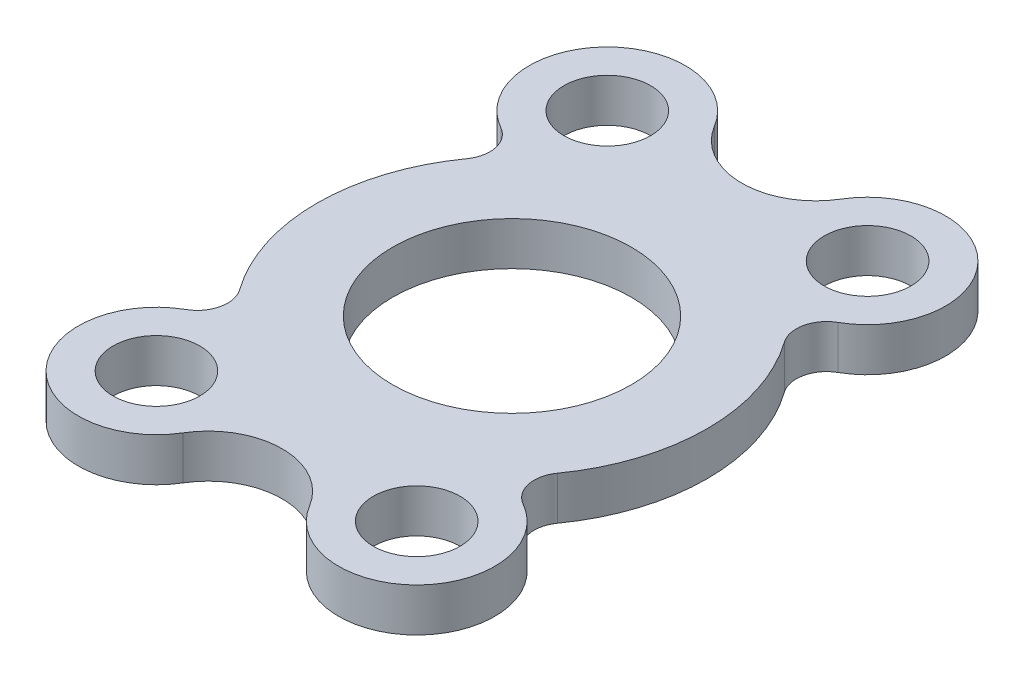
ISO-10303-21;
HEADER;
FILE_DESCRIPTION(('STEP AP214'),'2;1');
FILE_NAME('part.step','',(''),(''),'','','');
FILE_SCHEMA(('AUTOMOTIVE_DESIGN { 1 0 10303 214 1 1 1 1 }'));
ENDSEC;
DATA;
#1=APPLICATION_CONTEXT('core data for automotive mechanical design processes');
#2=APPLICATION_PROTOCOL_DEFINITION('international standard','automotive_design',2000,#1);
#3=PRODUCT_CONTEXT('',#1,'mechanical');
#4=PRODUCT('Part','Part','',(#3));
#5=PRODUCT_RELATED_PRODUCT_CATEGORY('part','',(#4));
#6=PRODUCT_DEFINITION_FORMATION('','',#4);
#7=PRODUCT_DEFINITION_CONTEXT('part definition',#1,'design');
#8=PRODUCT_DEFINITION('design','',#6,#7);
#9=PRODUCT_DEFINITION_SHAPE('','',#8);
#10=(LENGTH_UNIT() NAMED_UNIT(*) SI_UNIT(.MILLI.,.METRE.));
#11=(NAMED_UNIT(*) PLANE_ANGLE_UNIT() SI_UNIT($,.RADIAN.));
#12=(NAMED_UNIT(*) SI_UNIT($,.STERADIAN.) SOLID_ANGLE_UNIT());
#13=UNCERTAINTY_MEASURE_WITH_UNIT(LENGTH_MEASURE(1.E-05),#10,'distance_accuracy_value','');
#14=(GEOMETRIC_REPRESENTATION_CONTEXT(3) GLOBAL_UNCERTAINTY_ASSIGNED_CONTEXT((#13)) GLOBAL_UNIT_ASSIGNED_CONTEXT((#10,
#11,#12)) REPRESENTATION_CONTEXT('',''));
#15=CARTESIAN_POINT('',(0.,0.,0.));
#16=DIRECTION('',(0.,0.,1.));
#17=DIRECTION('',(1.,0.,0.));
#18=AXIS2_PLACEMENT_3D('',#15,#16,#17);
#19=CARTESIAN_POINT('',(36.1620897431582,10.,41.0859253931048));
#20=DIRECTION('',(0.,1.,0.));
#21=DIRECTION('',(0.,0.,1.));
#22=AXIS2_PLACEMENT_3D('',#19,#20,#21);
#23=PLANE('',#22);
#24=CARTESIAN_POINT('',(-30.0000000000001,10.,-51.9615242270663));
#25=DIRECTION('',(0.,1.,0.));
#26=DIRECTION('',(0.,0.,1.));
#27=AXIS2_PLACEMENT_3D('',#24,#25,#26);
#28=CIRCLE('',#27,10.);
#29=CARTESIAN_POINT('',(-30.0000000000001,10.,-41.9615242270663));
#30=VERTEX_POINT('',#29);
#31=EDGE_CURVE('E310',#30,#30,#28,.T.);
#32=ORIENTED_EDGE('',*,*,#31,.F.);
#33=EDGE_LOOP('',(#32));
#34=FACE_BOUND('',#33,.T.);
#35=CARTESIAN_POINT('',(-30.0000000000001,10.,51.9615242270663));
#36=DIRECTION('',(0.,1.,0.));
#37=DIRECTION('',(0.,0.,-1.));
#38=AXIS2_PLACEMENT_3D('',#35,#36,#37);
#39=CIRCLE('',#38,10.);
#40=CARTESIAN_POINT('',(-30.0000000000001,10.,41.9615242270663));
#41=VERTEX_POINT('',#40);
#42=EDGE_CURVE('E300',#41,#41,#39,.T.);
#43=ORIENTED_EDGE('',*,*,#42,.F.);
#44=EDGE_LOOP('',(#43));
#45=FACE_BOUND('',#44,.T.);
#46=CARTESIAN_POINT('',(42.3241794863164,10.,30.2103265591432));
#47=DIRECTION('',(0.,-1.,0.));
#48=DIRECTION('',(0.,0.,1.));
#49=AXIS2_PLACEMENT_3D('',#46,#47,#48);
#50=CIRCLE('',#49,7.);
#51=CARTESIAN_POINT('',(38.8734092301478,10.,36.3006619061617));
#52=VERTEX_POINT('',#51);
#53=CARTESIAN_POINT('',(36.6266937862353,10.,26.1435518300278));
#54=VERTEX_POINT('',#53);
#55=EDGE_CURVE('E235',#52,#54,#50,.T.);
#56=ORIENTED_EDGE('',*,*,#55,.T.);
#57=CARTESIAN_POINT('',(0.,10.,0.));
#58=DIRECTION('',(0.,1.,0.));
#59=DIRECTION('',(0.,0.,1.));
#60=AXIS2_PLACEMENT_3D('',#57,#58,#59);
#61=CIRCLE('',#60,45.);
#62=CARTESIAN_POINT('',(36.6266937862353,10.,-26.1435518300278));
#63=VERTEX_POINT('',#62);
#64=EDGE_CURVE('E119',#54,#63,#61,.T.);
#65=ORIENTED_EDGE('',*,*,#64,.T.);
#66=CARTESIAN_POINT('',(42.3241794863164,10.,-30.2103265591432));
#67=DIRECTION('',(0.,-1.,0.));
#68=DIRECTION('',(0.,0.,-1.));
#69=AXIS2_PLACEMENT_3D('',#66,#67,#68);
#70=CIRCLE('',#69,7.);
#71=CARTESIAN_POINT('',(38.8734092301478,10.,-36.3006619061617));
#72=VERTEX_POINT('',#71);
#73=EDGE_CURVE('E272',#63,#72,#70,.T.);
#74=ORIENTED_EDGE('',*,*,#73,.T.);
#75=CARTESIAN_POINT('',(30.0000000000001,10.,-51.9615242270663));
#76=DIRECTION('',(0.,1.,0.));
#77=DIRECTION('',(0.,0.,-1.));
#78=AXIS2_PLACEMENT_3D('',#75,#76,#77);
#79=CIRCLE('',#78,18.);
#80=CARTESIAN_POINT('',(14.5714285714286,10.,-61.232941792545));
#81=VERTEX_POINT('',#80);
#82=EDGE_CURVE('E463',#72,#81,#79,.T.);
#83=ORIENTED_EDGE('',*,*,#82,.T.);
#84=CARTESIAN_POINT('',(0.,10.,-69.9892806043861));
#85=DIRECTION('',(0.,-1.,0.));
#86=DIRECTION('',(0.,0.,-1.));
#87=AXIS2_PLACEMENT_3D('',#84,#85,#86);
#88=CIRCLE('',#87,17.);
#89=CARTESIAN_POINT('',(-14.5714285714286,10.,-61.2329417925451));
#90=VERTEX_POINT('',#89);
#91=EDGE_CURVE('E469',#81,#90,#88,.T.);
#92=ORIENTED_EDGE('',*,*,#91,.T.);
#93=CARTESIAN_POINT('',(-30.0000000000001,10.,-51.9615242270663));
#94=DIRECTION('',(0.,1.,0.));
#95=DIRECTION('',(0.,0.,1.));
#96=AXIS2_PLACEMENT_3D('',#93,#94,#95);
#97=CIRCLE('',#96,18.);
#98=CARTESIAN_POINT('',(-38.8734092301478,10.,-36.3006619061617));
#99=VERTEX_POINT('',#98);
#100=EDGE_CURVE('E474',#90,#99,#97,.T.);
#101=ORIENTED_EDGE('',*,*,#100,.T.);
#102=CARTESIAN_POINT('',(-42.3241794863164,10.,-30.2103265591432));
#103=DIRECTION('',(0.,-1.,0.));
#104=DIRECTION('',(0.,0.,1.));
#105=AXIS2_PLACEMENT_3D('',#102,#103,#104);
#106=CIRCLE('',#105,7.);
#107=CARTESIAN_POINT('',(-36.6266937862353,10.,-26.1435518300278));
#108=VERTEX_POINT('',#107);
#109=EDGE_CURVE('E479',#99,#108,#106,.T.);
#110=ORIENTED_EDGE('',*,*,#109,.T.);
#111=CARTESIAN_POINT('',(0.,10.,0.));
#112=DIRECTION('',(0.,1.,0.));
#113=DIRECTION('',(0.,0.,1.));
#114=AXIS2_PLACEMENT_3D('',#111,#112,#113);
#115=CIRCLE('',#114,45.);
#116=CARTESIAN_POINT('',(-36.6266937862353,10.,26.1435518300278));
#117=VERTEX_POINT('',#116);
#118=EDGE_CURVE('E436',#108,#117,#115,.T.);
#119=ORIENTED_EDGE('',*,*,#118,.T.);
#120=CARTESIAN_POINT('',(-42.3241794863164,10.,30.2103265591432));
#121=DIRECTION('',(0.,-1.,0.));
#122=DIRECTION('',(0.,0.,-1.));
#123=AXIS2_PLACEMENT_3D('',#120,#121,#122);
#124=CIRCLE('',#123,7.);
#125=CARTESIAN_POINT('',(-38.8734092301478,10.,36.3006619061617));
#126=VERTEX_POINT('',#125);
#127=EDGE_CURVE('E150',#117,#126,#124,.T.);
#128=ORIENTED_EDGE('',*,*,#127,.T.);
#129=CARTESIAN_POINT('',(-30.0000000000001,10.,51.9615242270663));
#130=DIRECTION('',(0.,1.,0.));
#131=DIRECTION('',(0.,0.,-1.));
#132=AXIS2_PLACEMENT_3D('',#129,#130,#131);
#133=CIRCLE('',#132,18.);
#134=CARTESIAN_POINT('',(-14.5714285714286,10.,61.232941792545));
#135=VERTEX_POINT('',#134);
#136=EDGE_CURVE('E144',#126,#135,#133,.T.);
#137=ORIENTED_EDGE('',*,*,#136,.T.);
#138=CARTESIAN_POINT('',(0.,10.,69.9892806043861));
#139=DIRECTION('',(0.,-1.,0.));
#140=DIRECTION('',(0.,0.,1.));
#141=AXIS2_PLACEMENT_3D('',#138,#139,#140);
#142=CIRCLE('',#141,17.);
#143=CARTESIAN_POINT('',(14.5714285714286,10.,61.232941792545));
#144=VERTEX_POINT('',#143);
#145=EDGE_CURVE('E148',#135,#144,#142,.T.);
#146=ORIENTED_EDGE('',*,*,#145,.T.);
#147=CARTESIAN_POINT('',(30.0000000000001,10.,51.9615242270663));
#148=DIRECTION('',(0.,1.,0.));
#149=DIRECTION('',(0.,0.,1.));
#150=AXIS2_PLACEMENT_3D('',#147,#148,#149);
#151=CIRCLE('',#150,18.);
#152=EDGE_CURVE('E64',#144,#52,#151,.T.);
#153=ORIENTED_EDGE('',*,*,#152,.T.);
#154=EDGE_LOOP('',(#56,#65,#74,#83,#92,#101,#110,#119,#128,#137,#146,#153));
#155=FACE_BOUND('',#154,.T.);
#156=CARTESIAN_POINT('',(30.0000000000001,10.,51.9615242270663));
#157=DIRECTION('',(0.,1.,0.));
#158=DIRECTION('',(0.,0.,1.));
#159=AXIS2_PLACEMENT_3D('',#156,#157,#158);
#160=CIRCLE('',#159,10.);
#161=CARTESIAN_POINT('',(30.0000000000001,10.,61.9615242270663));
#162=VERTEX_POINT('',#161);
#163=EDGE_CURVE('E190',#162,#162,#160,.T.);
#164=ORIENTED_EDGE('',*,*,#163,.F.);
#165=EDGE_LOOP('',(#164));
#166=FACE_BOUND('',#165,.T.);
#167=CARTESIAN_POINT('',(0.,10.,0.));
#168=DIRECTION('',(0.,1.,0.));
#169=DIRECTION('',(0.,0.,1.));
#170=AXIS2_PLACEMENT_3D('',#167,#168,#169);
#171=CIRCLE('',#170,27.5);
#172=CARTESIAN_POINT('',(0.,10.,27.5));
#173=VERTEX_POINT('',#172);
#174=EDGE_CURVE('E308',#173,#173,#171,.T.);
#175=ORIENTED_EDGE('',*,*,#174,.F.);
#176=EDGE_LOOP('',(#175));
#177=FACE_BOUND('',#176,.T.);
#178=CARTESIAN_POINT('',(30.0000000000001,10.,-51.9615242270663));
#179=DIRECTION('',(0.,1.,0.));
#180=DIRECTION('',(0.,0.,-1.));
#181=AXIS2_PLACEMENT_3D('',#178,#179,#180);
#182=CIRCLE('',#181,10.);
#183=CARTESIAN_POINT('',(30.0000000000001,10.,-61.9615242270663));
#184=VERTEX_POINT('',#183);
#185=EDGE_CURVE('E318',#184,#184,#182,.T.);
#186=ORIENTED_EDGE('',*,*,#185,.F.);
#187=EDGE_LOOP('',(#186));
#188=FACE_BOUND('',#187,.T.);
#189=ADVANCED_FACE('F46',(#34,#45,#155,#166,#177,#188),#23,.T.);
#190=CARTESIAN_POINT('',(36.1620897431582,0.,41.0859253931048));
#191=DIRECTION('',(0.,1.,0.));
#192=DIRECTION('',(0.,0.,1.));
#193=AXIS2_PLACEMENT_3D('',#190,#191,#192);
#194=PLANE('',#193);
#195=CARTESIAN_POINT('',(42.3241794863164,0.,30.2103265591432));
#196=DIRECTION('',(0.,-1.,0.));
#197=DIRECTION('',(0.,0.,1.));
#198=AXIS2_PLACEMENT_3D('',#195,#196,#197);
#199=CIRCLE('',#198,7.);
#200=CARTESIAN_POINT('',(38.8734092301478,0.,36.3006619061617));
#201=VERTEX_POINT('',#200);
#202=CARTESIAN_POINT('',(36.6266937862353,0.,26.1435518300278));
#203=VERTEX_POINT('',#202);
#204=EDGE_CURVE('E185',#201,#203,#199,.T.);
#205=ORIENTED_EDGE('',*,*,#204,.F.);
#206=CARTESIAN_POINT('',(30.0000000000001,0.,51.9615242270663));
#207=DIRECTION('',(0.,1.,0.));
#208=DIRECTION('',(0.,0.,1.));
#209=AXIS2_PLACEMENT_3D('',#206,#207,#208);
#210=CIRCLE('',#209,18.);
#211=CARTESIAN_POINT('',(14.5714285714286,0.,61.232941792545));
#212=VERTEX_POINT('',#211);
#213=EDGE_CURVE('E111',#212,#201,#210,.T.);
#214=ORIENTED_EDGE('',*,*,#213,.F.);
#215=CARTESIAN_POINT('',(0.,0.,69.9892806043861));
#216=DIRECTION('',(0.,-1.,0.));
#217=DIRECTION('',(0.,0.,1.));
#218=AXIS2_PLACEMENT_3D('',#215,#216,#217);
#219=CIRCLE('',#218,17.);
#220=CARTESIAN_POINT('',(-14.5714285714286,0.,61.232941792545));
#221=VERTEX_POINT('',#220);
#222=EDGE_CURVE('E105',#221,#212,#219,.T.);
#223=ORIENTED_EDGE('',*,*,#222,.F.);
#224=CARTESIAN_POINT('',(-30.0000000000001,0.,51.9615242270663));
#225=DIRECTION('',(0.,1.,0.));
#226=DIRECTION('',(0.,0.,-1.));
#227=AXIS2_PLACEMENT_3D('',#224,#225,#226);
#228=CIRCLE('',#227,18.);
#229=CARTESIAN_POINT('',(-38.8734092301478,0.,36.3006619061617));
#230=VERTEX_POINT('',#229);
#231=EDGE_CURVE('E159',#230,#221,#228,.T.);
#232=ORIENTED_EDGE('',*,*,#231,.F.);
#233=CARTESIAN_POINT('',(-42.3241794863164,0.,30.2103265591432));
#234=DIRECTION('',(0.,-1.,0.));
#235=DIRECTION('',(0.,0.,-1.));
#236=AXIS2_PLACEMENT_3D('',#233,#234,#235);
#237=CIRCLE('',#236,7.);
#238=CARTESIAN_POINT('',(-36.6266937862353,0.,26.1435518300278));
#239=VERTEX_POINT('',#238);
#240=EDGE_CURVE('E224',#239,#230,#237,.T.);
#241=ORIENTED_EDGE('',*,*,#240,.F.);
#242=CARTESIAN_POINT('',(0.,0.,0.));
#243=DIRECTION('',(0.,1.,0.));
#244=DIRECTION('',(0.,0.,1.));
#245=AXIS2_PLACEMENT_3D('',#242,#243,#244);
#246=CIRCLE('',#245,45.);
#247=CARTESIAN_POINT('',(-36.6266937862353,0.,-26.1435518300278));
#248=VERTEX_POINT('',#247);
#249=EDGE_CURVE('E217',#248,#239,#246,.T.);
#250=ORIENTED_EDGE('',*,*,#249,.F.);
#251=CARTESIAN_POINT('',(-42.3241794863164,0.,-30.2103265591432));
#252=DIRECTION('',(0.,-1.,0.));
#253=DIRECTION('',(0.,0.,1.));
#254=AXIS2_PLACEMENT_3D('',#251,#252,#253);
#255=CIRCLE('',#254,7.);
#256=CARTESIAN_POINT('',(-38.8734092301478,0.,-36.3006619061617));
#257=VERTEX_POINT('',#256);
#258=EDGE_CURVE('E213',#257,#248,#255,.T.);
#259=ORIENTED_EDGE('',*,*,#258,.F.);
#260=CARTESIAN_POINT('',(-30.0000000000001,0.,-51.9615242270663));
#261=DIRECTION('',(0.,1.,0.));
#262=DIRECTION('',(0.,0.,1.));
#263=AXIS2_PLACEMENT_3D('',#260,#261,#262);
#264=CIRCLE('',#263,18.);
#265=CARTESIAN_POINT('',(-14.5714285714286,0.,-61.2329417925451));
#266=VERTEX_POINT('',#265);
#267=EDGE_CURVE('E209',#266,#257,#264,.T.);
#268=ORIENTED_EDGE('',*,*,#267,.F.);
#269=CARTESIAN_POINT('',(0.,0.,-69.9892806043861));
#270=DIRECTION('',(0.,-1.,0.));
#271=DIRECTION('',(0.,0.,-1.));
#272=AXIS2_PLACEMENT_3D('',#269,#270,#271);
#273=CIRCLE('',#272,17.);
#274=CARTESIAN_POINT('',(14.5714285714286,0.,-61.232941792545));
#275=VERTEX_POINT('',#274);
#276=EDGE_CURVE('E206',#275,#266,#273,.T.);
#277=ORIENTED_EDGE('',*,*,#276,.F.);
#278=CARTESIAN_POINT('',(30.0000000000001,0.,-51.9615242270663));
#279=DIRECTION('',(0.,1.,0.));
#280=DIRECTION('',(0.,0.,-1.));
#281=AXIS2_PLACEMENT_3D('',#278,#279,#280);
#282=CIRCLE('',#281,18.);
#283=CARTESIAN_POINT('',(38.8734092301478,0.,-36.3006619061617));
#284=VERTEX_POINT('',#283);
#285=EDGE_CURVE('E198',#284,#275,#282,.T.);
#286=ORIENTED_EDGE('',*,*,#285,.F.);
#287=CARTESIAN_POINT('',(42.3241794863164,0.,-30.2103265591432));
#288=DIRECTION('',(0.,-1.,0.));
#289=DIRECTION('',(0.,0.,-1.));
#290=AXIS2_PLACEMENT_3D('',#287,#288,#289);
#291=CIRCLE('',#290,7.);
#292=CARTESIAN_POINT('',(36.6266937862353,0.,-26.1435518300278));
#293=VERTEX_POINT('',#292);
#294=EDGE_CURVE('E194',#293,#284,#291,.T.);
#295=ORIENTED_EDGE('',*,*,#294,.F.);
#296=CARTESIAN_POINT('',(0.,0.,0.));
#297=DIRECTION('',(0.,1.,0.));
#298=DIRECTION('',(0.,0.,1.));
#299=AXIS2_PLACEMENT_3D('',#296,#297,#298);
#300=CIRCLE('',#299,45.);
#301=EDGE_CURVE('E189',#203,#293,#300,.T.);
#302=ORIENTED_EDGE('',*,*,#301,.F.);
#303=EDGE_LOOP('',(#205,#214,#223,#232,#241,#250,#259,#268,#277,#286,#295,#302));
#304=FACE_BOUND('',#303,.T.);
#305=CARTESIAN_POINT('',(30.0000000000001,0.,51.9615242270663));
#306=DIRECTION('',(0.,1.,0.));
#307=DIRECTION('',(0.,0.,1.));
#308=AXIS2_PLACEMENT_3D('',#305,#306,#307);
#309=CIRCLE('',#308,10.);
#310=CARTESIAN_POINT('',(30.0000000000001,0.,61.9615242270663));
#311=VERTEX_POINT('',#310);
#312=EDGE_CURVE('E296',#311,#311,#309,.T.);
#313=ORIENTED_EDGE('',*,*,#312,.T.);
#314=EDGE_LOOP('',(#313));
#315=FACE_BOUND('',#314,.T.);
#316=CARTESIAN_POINT('',(-30.0000000000001,0.,51.9615242270663));
#317=DIRECTION('',(0.,1.,0.));
#318=DIRECTION('',(0.,0.,-1.));
#319=AXIS2_PLACEMENT_3D('',#316,#317,#318);
#320=CIRCLE('',#319,10.);
#321=CARTESIAN_POINT('',(-30.0000000000001,0.,41.9615242270663));
#322=VERTEX_POINT('',#321);
#323=EDGE_CURVE('E304',#322,#322,#320,.T.);
#324=ORIENTED_EDGE('',*,*,#323,.T.);
#325=EDGE_LOOP('',(#324));
#326=FACE_BOUND('',#325,.T.);
#327=CARTESIAN_POINT('',(0.,0.,0.));
#328=DIRECTION('',(0.,1.,0.));
#329=DIRECTION('',(0.,0.,1.));
#330=AXIS2_PLACEMENT_3D('',#327,#328,#329);
#331=CIRCLE('',#330,27.5);
#332=CARTESIAN_POINT('',(0.,0.,27.5));
#333=VERTEX_POINT('',#332);
#334=EDGE_CURVE('E313',#333,#333,#331,.T.);
#335=ORIENTED_EDGE('',*,*,#334,.T.);
#336=EDGE_LOOP('',(#335));
#337=FACE_BOUND('',#336,.T.);
#338=CARTESIAN_POINT('',(-30.0000000000001,0.,-51.9615242270663));
#339=DIRECTION('',(0.,1.,0.));
#340=DIRECTION('',(0.,0.,1.));
#341=AXIS2_PLACEMENT_3D('',#338,#339,#340);
#342=CIRCLE('',#341,10.);
#343=CARTESIAN_POINT('',(-30.0000000000001,0.,-41.9615242270663));
#344=VERTEX_POINT('',#343);
#345=EDGE_CURVE('E314',#344,#344,#342,.T.);
#346=ORIENTED_EDGE('',*,*,#345,.T.);
#347=EDGE_LOOP('',(#346));
#348=FACE_BOUND('',#347,.T.);
#349=CARTESIAN_POINT('',(30.0000000000001,0.,-51.9615242270663));
#350=DIRECTION('',(0.,1.,0.));
#351=DIRECTION('',(0.,0.,-1.));
#352=AXIS2_PLACEMENT_3D('',#349,#350,#351);
#353=CIRCLE('',#352,10.);
#354=CARTESIAN_POINT('',(30.0000000000001,0.,-61.9615242270663));
#355=VERTEX_POINT('',#354);
#356=EDGE_CURVE('E322',#355,#355,#353,.T.);
#357=ORIENTED_EDGE('',*,*,#356,.T.);
#358=EDGE_LOOP('',(#357));
#359=FACE_BOUND('',#358,.T.);
#360=ADVANCED_FACE('F276',(#304,#315,#326,#337,#348,#359),#194,.F.);
#361=CARTESIAN_POINT('',(42.3241794863164,10.,30.2103265591432));
#362=DIRECTION('',(0.,-1.,0.));
#363=DIRECTION('',(0.,0.,-1.));
#364=AXIS2_PLACEMENT_3D('',#361,#362,#363);
#365=CYLINDRICAL_SURFACE('',#364,7.);
#366=ORIENTED_EDGE('',*,*,#204,.T.);
#367=DIRECTION('',(0.,-1.,0.));
#368=VECTOR('',#367,1.);
#369=CARTESIAN_POINT('',(36.6266937862353,10.,26.1435518300278));
#370=LINE('',#369,#368);
#371=EDGE_CURVE('E12',#54,#203,#370,.T.);
#372=ORIENTED_EDGE('',*,*,#371,.F.);
#373=ORIENTED_EDGE('',*,*,#55,.F.);
#374=DIRECTION('',(0.,-1.,0.));
#375=VECTOR('',#374,1.);
#376=CARTESIAN_POINT('',(38.8734092301478,10.,36.3006619061617));
#377=LINE('',#376,#375);
#378=EDGE_CURVE('E170',#52,#201,#377,.T.);
#379=ORIENTED_EDGE('',*,*,#378,.T.);
#380=EDGE_LOOP('',(#366,#372,#373,#379));
#381=FACE_BOUND('',#380,.T.);
#382=ADVANCED_FACE('F48',(#381),#365,.F.);
#383=CARTESIAN_POINT('',(0.,10.,0.));
#384=DIRECTION('',(0.,-1.,0.));
#385=DIRECTION('',(0.,0.,-1.));
#386=AXIS2_PLACEMENT_3D('',#383,#384,#385);
#387=CYLINDRICAL_SURFACE('',#386,45.);
#388=ORIENTED_EDGE('',*,*,#301,.T.);
#389=DIRECTION('',(0.,-1.,0.));
#390=VECTOR('',#389,1.);
#391=CARTESIAN_POINT('',(36.6266937862353,10.,-26.1435518300278));
#392=LINE('',#391,#390);
#393=EDGE_CURVE('E56',#63,#293,#392,.T.);
#394=ORIENTED_EDGE('',*,*,#393,.F.);
#395=ORIENTED_EDGE('',*,*,#64,.F.);
#396=ORIENTED_EDGE('',*,*,#371,.T.);
#397=EDGE_LOOP('',(#388,#394,#395,#396));
#398=FACE_BOUND('',#397,.T.);
#399=ADVANCED_FACE('F423',(#398),#387,.T.);
#400=CARTESIAN_POINT('',(42.3241794863164,10.,-30.2103265591432));
#401=DIRECTION('',(0.,-1.,0.));
#402=DIRECTION('',(0.,0.,-1.));
#403=AXIS2_PLACEMENT_3D('',#400,#401,#402);
#404=CYLINDRICAL_SURFACE('',#403,7.);
#405=ORIENTED_EDGE('',*,*,#294,.T.);
#406=DIRECTION('',(0.,-1.,0.));
#407=VECTOR('',#406,1.);
#408=CARTESIAN_POINT('',(38.8734092301478,10.,-36.3006619061617));
#409=LINE('',#408,#407);
#410=EDGE_CURVE('E262',#72,#284,#409,.T.);
#411=ORIENTED_EDGE('',*,*,#410,.F.);
#412=ORIENTED_EDGE('',*,*,#73,.F.);
#413=ORIENTED_EDGE('',*,*,#393,.T.);
#414=EDGE_LOOP('',(#405,#411,#412,#413));
#415=FACE_BOUND('',#414,.T.);
#416=ADVANCED_FACE('F270',(#415),#404,.F.);
#417=CARTESIAN_POINT('',(30.0000000000001,10.,-51.9615242270663));
#418=DIRECTION('',(0.,-1.,0.));
#419=DIRECTION('',(0.,0.,-1.));
#420=AXIS2_PLACEMENT_3D('',#417,#418,#419);
#421=CYLINDRICAL_SURFACE('',#420,18.);
#422=ORIENTED_EDGE('',*,*,#285,.T.);
#423=DIRECTION('',(0.,-1.,0.));
#424=VECTOR('',#423,1.);
#425=CARTESIAN_POINT('',(14.5714285714286,10.,-61.232941792545));
#426=LINE('',#425,#424);
#427=EDGE_CURVE('E258',#81,#275,#426,.T.);
#428=ORIENTED_EDGE('',*,*,#427,.F.);
#429=ORIENTED_EDGE('',*,*,#82,.F.);
#430=ORIENTED_EDGE('',*,*,#410,.T.);
#431=EDGE_LOOP('',(#422,#428,#429,#430));
#432=FACE_BOUND('',#431,.T.);
#433=ADVANCED_FACE('F418',(#432),#421,.T.);
#434=CARTESIAN_POINT('',(0.,10.,-69.9892806043861));
#435=DIRECTION('',(0.,-1.,0.));
#436=DIRECTION('',(0.,0.,-1.));
#437=AXIS2_PLACEMENT_3D('',#434,#435,#436);
#438=CYLINDRICAL_SURFACE('',#437,17.);
#439=ORIENTED_EDGE('',*,*,#276,.T.);
#440=DIRECTION('',(0.,-1.,0.));
#441=VECTOR('',#440,1.);
#442=CARTESIAN_POINT('',(-14.5714285714286,10.,-61.2329417925451));
#443=LINE('',#442,#441);
#444=EDGE_CURVE('E254',#90,#266,#443,.T.);
#445=ORIENTED_EDGE('',*,*,#444,.F.);
#446=ORIENTED_EDGE('',*,*,#91,.F.);
#447=ORIENTED_EDGE('',*,*,#427,.T.);
#448=EDGE_LOOP('',(#439,#445,#446,#447));
#449=FACE_BOUND('',#448,.T.);
#450=ADVANCED_FACE('F414',(#449),#438,.F.);
#451=CARTESIAN_POINT('',(-30.0000000000001,10.,-51.9615242270663));
#452=DIRECTION('',(0.,-1.,0.));
#453=DIRECTION('',(0.,0.,-1.));
#454=AXIS2_PLACEMENT_3D('',#451,#452,#453);
#455=CYLINDRICAL_SURFACE('',#454,18.);
#456=ORIENTED_EDGE('',*,*,#267,.T.);
#457=DIRECTION('',(0.,-1.,0.));
#458=VECTOR('',#457,1.);
#459=CARTESIAN_POINT('',(-38.8734092301478,10.,-36.3006619061617));
#460=LINE('',#459,#458);
#461=EDGE_CURVE('E250',#99,#257,#460,.T.);
#462=ORIENTED_EDGE('',*,*,#461,.F.);
#463=ORIENTED_EDGE('',*,*,#100,.F.);
#464=ORIENTED_EDGE('',*,*,#444,.T.);
#465=EDGE_LOOP('',(#456,#462,#463,#464));
#466=FACE_BOUND('',#465,.T.);
#467=ADVANCED_FACE('F410',(#466),#455,.T.);
#468=CARTESIAN_POINT('',(-42.3241794863164,10.,-30.2103265591432));
#469=DIRECTION('',(0.,-1.,0.));
#470=DIRECTION('',(0.,0.,-1.));
#471=AXIS2_PLACEMENT_3D('',#468,#469,#470);
#472=CYLINDRICAL_SURFACE('',#471,7.);
#473=ORIENTED_EDGE('',*,*,#258,.T.);
#474=DIRECTION('',(0.,-1.,0.));
#475=VECTOR('',#474,1.);
#476=CARTESIAN_POINT('',(-36.6266937862353,10.,-26.1435518300278));
#477=LINE('',#476,#475);
#478=EDGE_CURVE('E246',#108,#248,#477,.T.);
#479=ORIENTED_EDGE('',*,*,#478,.F.);
#480=ORIENTED_EDGE('',*,*,#109,.F.);
#481=ORIENTED_EDGE('',*,*,#461,.T.);
#482=EDGE_LOOP('',(#473,#479,#480,#481));
#483=FACE_BOUND('',#482,.T.);
#484=ADVANCED_FACE('F406',(#483),#472,.F.);
#485=CARTESIAN_POINT('',(0.,10.,0.));
#486=DIRECTION('',(0.,-1.,0.));
#487=DIRECTION('',(0.,0.,-1.));
#488=AXIS2_PLACEMENT_3D('',#485,#486,#487);
#489=CYLINDRICAL_SURFACE('',#488,45.);
#490=ORIENTED_EDGE('',*,*,#249,.T.);
#491=DIRECTION('',(0.,-1.,0.));
#492=VECTOR('',#491,1.);
#493=CARTESIAN_POINT('',(-36.6266937862353,10.,26.1435518300278));
#494=LINE('',#493,#492);
#495=EDGE_CURVE('E242',#117,#239,#494,.T.);
#496=ORIENTED_EDGE('',*,*,#495,.F.);
#497=ORIENTED_EDGE('',*,*,#118,.F.);
#498=ORIENTED_EDGE('',*,*,#478,.T.);
#499=EDGE_LOOP('',(#490,#496,#497,#498));
#500=FACE_BOUND('',#499,.T.);
#501=ADVANCED_FACE('F402',(#500),#489,.T.);
#502=CARTESIAN_POINT('',(-42.3241794863164,10.,30.2103265591432));
#503=DIRECTION('',(0.,-1.,0.));
#504=DIRECTION('',(0.,0.,-1.));
#505=AXIS2_PLACEMENT_3D('',#502,#503,#504);
#506=CYLINDRICAL_SURFACE('',#505,7.);
#507=ORIENTED_EDGE('',*,*,#240,.T.);
#508=DIRECTION('',(0.,-1.,0.));
#509=VECTOR('',#508,1.);
#510=CARTESIAN_POINT('',(-38.8734092301478,10.,36.3006619061617));
#511=LINE('',#510,#509);
#512=EDGE_CURVE('E161',#126,#230,#511,.T.);
#513=ORIENTED_EDGE('',*,*,#512,.F.);
#514=ORIENTED_EDGE('',*,*,#127,.F.);
#515=ORIENTED_EDGE('',*,*,#495,.T.);
#516=EDGE_LOOP('',(#507,#513,#514,#515));
#517=FACE_BOUND('',#516,.T.);
#518=ADVANCED_FACE('F399',(#517),#506,.F.);
#519=CARTESIAN_POINT('',(-30.0000000000001,10.,51.9615242270663));
#520=DIRECTION('',(0.,-1.,0.));
#521=DIRECTION('',(0.,0.,-1.));
#522=AXIS2_PLACEMENT_3D('',#519,#520,#521);
#523=CYLINDRICAL_SURFACE('',#522,18.);
#524=ORIENTED_EDGE('',*,*,#231,.T.);
#525=DIRECTION('',(0.,-1.,0.));
#526=VECTOR('',#525,1.);
#527=CARTESIAN_POINT('',(-14.5714285714286,10.,61.232941792545));
#528=LINE('',#527,#526);
#529=EDGE_CURVE('E156',#135,#221,#528,.T.);
#530=ORIENTED_EDGE('',*,*,#529,.F.);
#531=ORIENTED_EDGE('',*,*,#136,.F.);
#532=ORIENTED_EDGE('',*,*,#512,.T.);
#533=EDGE_LOOP('',(#524,#530,#531,#532));
#534=FACE_BOUND('',#533,.T.);
#535=ADVANCED_FACE('F157',(#534),#523,.T.);
#536=CARTESIAN_POINT('',(0.,10.,69.9892806043861));
#537=DIRECTION('',(0.,-1.,0.));
#538=DIRECTION('',(0.,0.,-1.));
#539=AXIS2_PLACEMENT_3D('',#536,#537,#538);
#540=CYLINDRICAL_SURFACE('',#539,17.);
#541=ORIENTED_EDGE('',*,*,#222,.T.);
#542=DIRECTION('',(0.,-1.,0.));
#543=VECTOR('',#542,1.);
#544=CARTESIAN_POINT('',(14.5714285714286,10.,61.232941792545));
#545=LINE('',#544,#543);
#546=EDGE_CURVE('E162',#144,#212,#545,.T.);
#547=ORIENTED_EDGE('',*,*,#546,.F.);
#548=ORIENTED_EDGE('',*,*,#145,.F.);
#549=ORIENTED_EDGE('',*,*,#529,.T.);
#550=EDGE_LOOP('',(#541,#547,#548,#549));
#551=FACE_BOUND('',#550,.T.);
#552=ADVANCED_FACE('F164',(#551),#540,.F.);
#553=CARTESIAN_POINT('',(30.0000000000001,10.,51.9615242270663));
#554=DIRECTION('',(0.,-1.,0.));
#555=DIRECTION('',(0.,0.,-1.));
#556=AXIS2_PLACEMENT_3D('',#553,#554,#555);
#557=CYLINDRICAL_SURFACE('',#556,18.);
#558=ORIENTED_EDGE('',*,*,#213,.T.);
#559=ORIENTED_EDGE('',*,*,#378,.F.);
#560=ORIENTED_EDGE('',*,*,#152,.F.);
#561=ORIENTED_EDGE('',*,*,#546,.T.);
#562=EDGE_LOOP('',(#558,#559,#560,#561));
#563=FACE_BOUND('',#562,.T.);
#564=ADVANCED_FACE('F392',(#563),#557,.T.);
#565=CARTESIAN_POINT('',(30.0000000000001,10.,51.9615242270663));
#566=DIRECTION('',(0.,-1.,0.));
#567=DIRECTION('',(0.,0.,-1.));
#568=AXIS2_PLACEMENT_3D('',#565,#566,#567);
#569=CYLINDRICAL_SURFACE('',#568,10.);
#570=ORIENTED_EDGE('',*,*,#163,.T.);
#571=EDGE_LOOP('',(#570));
#572=FACE_BOUND('',#571,.T.);
#573=ORIENTED_EDGE('',*,*,#312,.F.);
#574=EDGE_LOOP('',(#573));
#575=FACE_BOUND('',#574,.T.);
#576=ADVANCED_FACE('F377',(#572,#575),#569,.F.);
#577=CARTESIAN_POINT('',(-30.0000000000001,10.,51.9615242270663));
#578=DIRECTION('',(0.,-1.,0.));
#579=DIRECTION('',(0.,0.,-1.));
#580=AXIS2_PLACEMENT_3D('',#577,#578,#579);
#581=CYLINDRICAL_SURFACE('',#580,10.);
#582=ORIENTED_EDGE('',*,*,#42,.T.);
#583=EDGE_LOOP('',(#582));
#584=FACE_BOUND('',#583,.T.);
#585=ORIENTED_EDGE('',*,*,#323,.F.);
#586=EDGE_LOOP('',(#585));
#587=FACE_BOUND('',#586,.T.);
#588=ADVANCED_FACE('F367',(#584,#587),#581,.F.);
#589=CARTESIAN_POINT('',(0.,10.,0.));
#590=DIRECTION('',(0.,-1.,0.));
#591=DIRECTION('',(0.,0.,-1.));
#592=AXIS2_PLACEMENT_3D('',#589,#590,#591);
#593=CYLINDRICAL_SURFACE('',#592,27.5);
#594=ORIENTED_EDGE('',*,*,#174,.T.);
#595=EDGE_LOOP('',(#594));
#596=FACE_BOUND('',#595,.T.);
#597=ORIENTED_EDGE('',*,*,#334,.F.);
#598=EDGE_LOOP('',(#597));
#599=FACE_BOUND('',#598,.T.);
#600=ADVANCED_FACE('F364',(#596,#599),#593,.F.);
#601=CARTESIAN_POINT('',(-30.0000000000001,10.,-51.9615242270663));
#602=DIRECTION('',(0.,-1.,0.));
#603=DIRECTION('',(0.,0.,-1.));
#604=AXIS2_PLACEMENT_3D('',#601,#602,#603);
#605=CYLINDRICAL_SURFACE('',#604,10.);
#606=ORIENTED_EDGE('',*,*,#31,.T.);
#607=EDGE_LOOP('',(#606));
#608=FACE_BOUND('',#607,.T.);
#609=ORIENTED_EDGE('',*,*,#345,.F.);
#610=EDGE_LOOP('',(#609));
#611=FACE_BOUND('',#610,.T.);
#612=ADVANCED_FACE('F366',(#608,#611),#605,.F.);
#613=CARTESIAN_POINT('',(30.0000000000001,10.,-51.9615242270663));
#614=DIRECTION('',(0.,-1.,0.));
#615=DIRECTION('',(0.,0.,-1.));
#616=AXIS2_PLACEMENT_3D('',#613,#614,#615);
#617=CYLINDRICAL_SURFACE('',#616,10.);
#618=ORIENTED_EDGE('',*,*,#185,.T.);
#619=EDGE_LOOP('',(#618));
#620=FACE_BOUND('',#619,.T.);
#621=ORIENTED_EDGE('',*,*,#356,.F.);
#622=EDGE_LOOP('',(#621));
#623=FACE_BOUND('',#622,.T.);
#624=ADVANCED_FACE('F374',(#620,#623),#617,.F.);
#625=CLOSED_SHELL('',(#189,#360,#382,#399,#416,#433,#450,#467,#484,#501,#518,#535,#552,#564,
#576,#588,#600,#612,#624));
#626=MANIFOLD_SOLID_BREP('B2',#625);
#627=ADVANCED_BREP_SHAPE_REPRESENTATION('',(#18,#626),#14);
#628=SHAPE_DEFINITION_REPRESENTATION(#9,#627);
ENDSEC;
END-ISO-10303-21;
